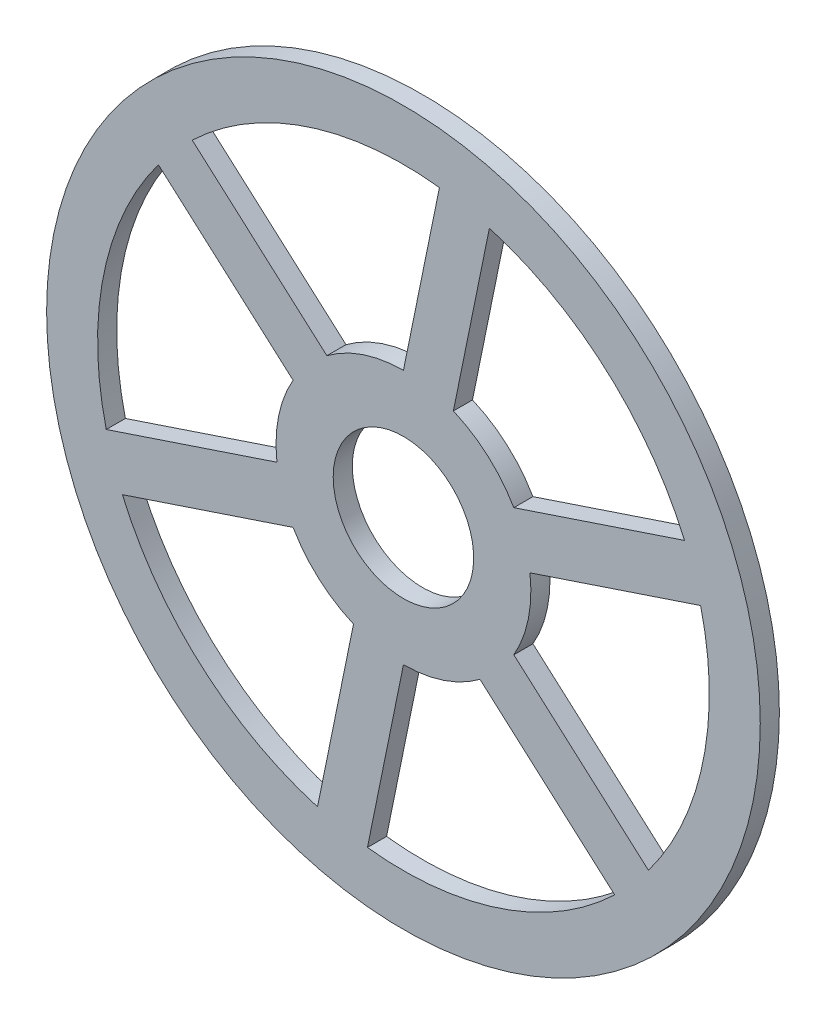
ISO-10303-21;
HEADER;
FILE_DESCRIPTION(('STEP AP214'),'2;1');
FILE_NAME('part.step','',(''),(''),'','','');
FILE_SCHEMA(('AUTOMOTIVE_DESIGN { 1 0 10303 214 1 1 1 1 }'));
ENDSEC;
DATA;
#1=APPLICATION_CONTEXT('core data for automotive mechanical design processes');
#2=APPLICATION_PROTOCOL_DEFINITION('international standard','automotive_design',2000,#1);
#3=PRODUCT_CONTEXT('',#1,'mechanical');
#4=PRODUCT('Part','Part','',(#3));
#5=PRODUCT_RELATED_PRODUCT_CATEGORY('part','',(#4));
#6=PRODUCT_DEFINITION_FORMATION('','',#4);
#7=PRODUCT_DEFINITION_CONTEXT('part definition',#1,'design');
#8=PRODUCT_DEFINITION('design','',#6,#7);
#9=PRODUCT_DEFINITION_SHAPE('','',#8);
#10=(LENGTH_UNIT() NAMED_UNIT(*) SI_UNIT(.MILLI.,.METRE.));
#11=(NAMED_UNIT(*) PLANE_ANGLE_UNIT() SI_UNIT($,.RADIAN.));
#12=(NAMED_UNIT(*) SI_UNIT($,.STERADIAN.) SOLID_ANGLE_UNIT());
#13=UNCERTAINTY_MEASURE_WITH_UNIT(LENGTH_MEASURE(1.E-05),#10,'distance_accuracy_value','');
#14=(GEOMETRIC_REPRESENTATION_CONTEXT(3) GLOBAL_UNCERTAINTY_ASSIGNED_CONTEXT((#13)) GLOBAL_UNIT_ASSIGNED_CONTEXT((#10,
#11,#12)) REPRESENTATION_CONTEXT('',''));
#15=CARTESIAN_POINT('',(0.,0.,0.));
#16=DIRECTION('',(0.,0.,1.));
#17=DIRECTION('',(1.,0.,0.));
#18=AXIS2_PLACEMENT_3D('',#15,#16,#17);
#19=CARTESIAN_POINT('',(0.,0.,4.7625));
#20=DIRECTION('',(0.,0.,1.));
#21=DIRECTION('',(1.,0.,0.));
#22=AXIS2_PLACEMENT_3D('',#19,#20,#21);
#23=PLANE('',#22);
#24=CARTESIAN_POINT('',(0.,0.,4.7625));
#25=DIRECTION('',(0.,0.,1.));
#26=DIRECTION('',(1.,0.,0.));
#27=AXIS2_PLACEMENT_3D('',#24,#25,#26);
#28=CIRCLE('',#27,88.9);
#29=CARTESIAN_POINT('',(-88.9,0.,4.7625));
#30=VERTEX_POINT('',#29);
#31=EDGE_CURVE('E11',#30,#30,#28,.T.);
#32=ORIENTED_EDGE('',*,*,#31,.T.);
#33=EDGE_LOOP('',(#32));
#34=FACE_BOUND('',#33,.T.);
#35=CARTESIAN_POINT('',(0.,0.,4.7625));
#36=DIRECTION('',(0.,0.,1.));
#37=DIRECTION('',(1.,0.,0.));
#38=AXIS2_PLACEMENT_3D('',#35,#36,#37);
#39=CIRCLE('',#38,17.5);
#40=CARTESIAN_POINT('',(-17.5,0.,4.7625));
#41=VERTEX_POINT('',#40);
#42=EDGE_CURVE('E385',#41,#41,#39,.T.);
#43=ORIENTED_EDGE('',*,*,#42,.F.);
#44=EDGE_LOOP('',(#43));
#45=FACE_BOUND('',#44,.T.);
#46=DIRECTION('',(0.200000000000003,0.979795897113271,0.));
#47=VECTOR('',#46,1.);
#48=CARTESIAN_POINT('',(8.96528719706963,75.6707580606542,4.7625));
#49=LINE('',#48,#47);
#50=CARTESIAN_POINT('',(0.,31.75,4.7625));
#51=VERTEX_POINT('',#50);
#52=CARTESIAN_POINT('',(8.96528719706962,75.6707580606542,4.7625));
#53=VERTEX_POINT('',#52);
#54=EDGE_CURVE('E356',#51,#53,#49,.T.);
#55=ORIENTED_EDGE('',*,*,#54,.F.);
#56=CARTESIAN_POINT('',(0.,0.,4.7625));
#57=DIRECTION('',(0.,0.,-1.));
#58=DIRECTION('',(-1.,0.,0.));
#59=AXIS2_PLACEMENT_3D('',#56,#57,#58);
#60=CIRCLE('',#59,31.75);
#61=CARTESIAN_POINT('',(-19.0748980978741,25.381307345283,4.7625));
#62=VERTEX_POINT('',#61);
#63=EDGE_CURVE('E354',#62,#51,#60,.T.);
#64=ORIENTED_EDGE('',*,*,#63,.F.);
#65=DIRECTION('',(0.748528137423855,-0.663103029313525,0.));
#66=VECTOR('',#65,1.);
#67=CARTESIAN_POINT('',(-52.628746733336,55.1058528404958,4.7625));
#68=LINE('',#67,#66);
#69=CARTESIAN_POINT('',(-52.628746733336,55.1058528404958,4.7625));
#70=VERTEX_POINT('',#69);
#71=EDGE_CURVE('E362',#70,#62,#68,.T.);
#72=ORIENTED_EDGE('',*,*,#71,.F.);
#73=CARTESIAN_POINT('',(0.,0.,4.7625));
#74=DIRECTION('',(0.,0.,1.));
#75=DIRECTION('',(-1.,0.,0.));
#76=AXIS2_PLACEMENT_3D('',#73,#74,#75);
#77=CIRCLE('',#76,76.2);
#78=EDGE_CURVE('E359',#53,#70,#77,.T.);
#79=ORIENTED_EDGE('',*,*,#78,.F.);
#80=EDGE_LOOP('',(#55,#64,#72,#79));
#81=FACE_BOUND('',#80,.T.);
#82=DIRECTION('',(0.948528137423858,0.316692867799745,0.));
#83=VECTOR('',#82,1.);
#84=CARTESIAN_POINT('',(70.0154424026874,30.0712125654414,4.7625));
#85=LINE('',#84,#83);
#86=CARTESIAN_POINT('',(27.4963065701559,15.875,4.7625));
#87=VERTEX_POINT('',#86);
#88=CARTESIAN_POINT('',(70.0154424026874,30.0712125654414,4.7625));
#89=VERTEX_POINT('',#88);
#90=EDGE_CURVE('E325',#87,#89,#85,.T.);
#91=ORIENTED_EDGE('',*,*,#90,.F.);
#92=CARTESIAN_POINT('',(0.,0.,4.7625));
#93=DIRECTION('',(0.,0.,-1.));
#94=DIRECTION('',(-1.,0.,0.));
#95=AXIS2_PLACEMENT_3D('',#92,#93,#94);
#96=CIRCLE('',#95,31.75);
#97=CARTESIAN_POINT('',(12.4434078933386,29.21,4.7625));
#98=VERTEX_POINT('',#97);
#99=EDGE_CURVE('E323',#98,#87,#96,.T.);
#100=ORIENTED_EDGE('',*,*,#99,.F.);
#101=DIRECTION('',(-0.200000000000002,-0.979795897113271,0.));
#102=VECTOR('',#101,1.);
#103=CARTESIAN_POINT('',(21.4086950904082,73.1307580606542,4.7625));
#104=LINE('',#103,#102);
#105=CARTESIAN_POINT('',(21.4086950904082,73.1307580606542,4.7625));
#106=VERTEX_POINT('',#105);
#107=EDGE_CURVE('E331',#106,#98,#104,.T.);
#108=ORIENTED_EDGE('',*,*,#107,.F.);
#109=CARTESIAN_POINT('',(0.,0.,4.7625));
#110=DIRECTION('',(0.,0.,1.));
#111=DIRECTION('',(-1.,0.,0.));
#112=AXIS2_PLACEMENT_3D('',#109,#110,#111);
#113=CIRCLE('',#112,76.2);
#114=EDGE_CURVE('E328',#89,#106,#113,.T.);
#115=ORIENTED_EDGE('',*,*,#114,.F.);
#116=EDGE_LOOP('',(#91,#100,#108,#115));
#117=FACE_BOUND('',#116,.T.);
#118=DIRECTION('',(0.748528137423855,-0.663103029313525,0.));
#119=VECTOR('',#118,1.);
#120=CARTESIAN_POINT('',(61.0501552056178,-45.5995454952128,4.7625));
#121=LINE('',#120,#119);
#122=CARTESIAN_POINT('',(27.4963065701559,-15.875,4.7625));
#123=VERTEX_POINT('',#122);
#124=CARTESIAN_POINT('',(61.0501552056178,-45.5995454952127,4.7625));
#125=VERTEX_POINT('',#124);
#126=EDGE_CURVE('E294',#123,#125,#121,.T.);
#127=ORIENTED_EDGE('',*,*,#126,.F.);
#128=CARTESIAN_POINT('',(0.,0.,4.7625));
#129=DIRECTION('',(0.,0.,-1.));
#130=DIRECTION('',(-1.,0.,0.));
#131=AXIS2_PLACEMENT_3D('',#128,#129,#130);
#132=CIRCLE('',#131,31.75);
#133=CARTESIAN_POINT('',(31.5183059912127,3.82869265471704,4.7625));
#134=VERTEX_POINT('',#133);
#135=EDGE_CURVE('E292',#134,#123,#132,.T.);
#136=ORIENTED_EDGE('',*,*,#135,.F.);
#137=DIRECTION('',(-0.948528137423858,-0.316692867799745,0.));
#138=VECTOR('',#137,1.);
#139=CARTESIAN_POINT('',(74.0374418237442,18.0249052201584,4.7625));
#140=LINE('',#139,#138);
#141=CARTESIAN_POINT('',(74.0374418237442,18.0249052201584,4.7625));
#142=VERTEX_POINT('',#141);
#143=EDGE_CURVE('E300',#142,#134,#140,.T.);
#144=ORIENTED_EDGE('',*,*,#143,.F.);
#145=CARTESIAN_POINT('',(0.,0.,4.7625));
#146=DIRECTION('',(0.,0.,1.));
#147=DIRECTION('',(-1.,0.,0.));
#148=AXIS2_PLACEMENT_3D('',#145,#146,#147);
#149=CIRCLE('',#148,76.2);
#150=EDGE_CURVE('E297',#125,#142,#149,.T.);
#151=ORIENTED_EDGE('',*,*,#150,.F.);
#152=EDGE_LOOP('',(#127,#136,#144,#151));
#153=FACE_BOUND('',#152,.T.);
#154=DIRECTION('',(-0.200000000000003,-0.979795897113271,0.));
#155=VECTOR('',#154,1.);
#156=CARTESIAN_POINT('',(-8.96528719706962,-75.6707580606542,4.7625));
#157=LINE('',#156,#155);
#158=CARTESIAN_POINT('',(0.,-31.75,4.7625));
#159=VERTEX_POINT('',#158);
#160=CARTESIAN_POINT('',(-8.96528719706959,-75.6707580606542,4.7625));
#161=VERTEX_POINT('',#160);
#162=EDGE_CURVE('E263',#159,#161,#157,.T.);
#163=ORIENTED_EDGE('',*,*,#162,.F.);
#164=CARTESIAN_POINT('',(0.,0.,4.7625));
#165=DIRECTION('',(0.,0.,-1.));
#166=DIRECTION('',(-1.,0.,0.));
#167=AXIS2_PLACEMENT_3D('',#164,#165,#166);
#168=CIRCLE('',#167,31.75);
#169=CARTESIAN_POINT('',(19.0748980978742,-25.381307345283,4.7625));
#170=VERTEX_POINT('',#169);
#171=EDGE_CURVE('E261',#170,#159,#168,.T.);
#172=ORIENTED_EDGE('',*,*,#171,.F.);
#173=DIRECTION('',(-0.748528137423855,0.663103029313526,0.));
#174=VECTOR('',#173,1.);
#175=CARTESIAN_POINT('',(52.628746733336,-55.1058528404957,4.7625));
#176=LINE('',#175,#174);
#177=CARTESIAN_POINT('',(52.628746733336,-55.1058528404957,4.7625));
#178=VERTEX_POINT('',#177);
#179=EDGE_CURVE('E269',#178,#170,#176,.T.);
#180=ORIENTED_EDGE('',*,*,#179,.F.);
#181=CARTESIAN_POINT('',(0.,0.,4.7625));
#182=DIRECTION('',(0.,0.,1.));
#183=DIRECTION('',(-1.,0.,0.));
#184=AXIS2_PLACEMENT_3D('',#181,#182,#183);
#185=CIRCLE('',#184,76.2);
#186=EDGE_CURVE('E266',#161,#178,#185,.T.);
#187=ORIENTED_EDGE('',*,*,#186,.F.);
#188=EDGE_LOOP('',(#163,#172,#180,#187));
#189=FACE_BOUND('',#188,.T.);
#190=DIRECTION('',(-0.948528137423858,-0.316692867799746,0.));
#191=VECTOR('',#190,1.);
#192=CARTESIAN_POINT('',(-70.0154424026874,-30.0712125654414,4.7625));
#193=LINE('',#192,#191);
#194=CARTESIAN_POINT('',(-27.4963065701559,-15.875,4.7625));
#195=VERTEX_POINT('',#194);
#196=CARTESIAN_POINT('',(-70.0154424026874,-30.0712125654415,4.7625));
#197=VERTEX_POINT('',#196);
#198=EDGE_CURVE('E232',#195,#197,#193,.T.);
#199=ORIENTED_EDGE('',*,*,#198,.F.);
#200=CARTESIAN_POINT('',(0.,0.,4.7625));
#201=DIRECTION('',(0.,0.,-1.));
#202=DIRECTION('',(-1.,0.,0.));
#203=AXIS2_PLACEMENT_3D('',#200,#201,#202);
#204=CIRCLE('',#203,31.75);
#205=CARTESIAN_POINT('',(-12.4434078933385,-29.21,4.7625));
#206=VERTEX_POINT('',#205);
#207=EDGE_CURVE('E230',#206,#195,#204,.T.);
#208=ORIENTED_EDGE('',*,*,#207,.F.);
#209=DIRECTION('',(0.200000000000003,0.979795897113271,0.));
#210=VECTOR('',#209,1.);
#211=CARTESIAN_POINT('',(-21.4086950904082,-73.1307580606542,4.7625));
#212=LINE('',#211,#210);
#213=CARTESIAN_POINT('',(-21.4086950904082,-73.1307580606542,4.7625));
#214=VERTEX_POINT('',#213);
#215=EDGE_CURVE('E238',#214,#206,#212,.T.);
#216=ORIENTED_EDGE('',*,*,#215,.F.);
#217=CARTESIAN_POINT('',(0.,0.,4.7625));
#218=DIRECTION('',(0.,0.,1.));
#219=DIRECTION('',(-1.,0.,0.));
#220=AXIS2_PLACEMENT_3D('',#217,#218,#219);
#221=CIRCLE('',#220,76.2);
#222=EDGE_CURVE('E235',#197,#214,#221,.T.);
#223=ORIENTED_EDGE('',*,*,#222,.F.);
#224=EDGE_LOOP('',(#199,#208,#216,#223));
#225=FACE_BOUND('',#224,.T.);
#226=DIRECTION('',(-0.748528137423856,0.663103029313525,0.));
#227=VECTOR('',#226,1.);
#228=CARTESIAN_POINT('',(-61.0501552056178,45.5995454952127,4.7625));
#229=LINE('',#228,#227);
#230=CARTESIAN_POINT('',(-27.496306570156,15.875,4.7625));
#231=VERTEX_POINT('',#230);
#232=CARTESIAN_POINT('',(-61.0501552056178,45.5995454952127,4.7625));
#233=VERTEX_POINT('',#232);
#234=EDGE_CURVE('E202',#231,#233,#229,.T.);
#235=ORIENTED_EDGE('',*,*,#234,.F.);
#236=CARTESIAN_POINT('',(0.,0.,4.7625));
#237=DIRECTION('',(0.,0.,-1.));
#238=DIRECTION('',(-1.,0.,0.));
#239=AXIS2_PLACEMENT_3D('',#236,#237,#238);
#240=CIRCLE('',#239,31.75);
#241=CARTESIAN_POINT('',(-31.5183059912127,-3.82869265471706,4.7625));
#242=VERTEX_POINT('',#241);
#243=EDGE_CURVE('E194',#242,#231,#240,.T.);
#244=ORIENTED_EDGE('',*,*,#243,.F.);
#245=DIRECTION('',(0.948528137423858,0.316692867799745,0.));
#246=VECTOR('',#245,1.);
#247=CARTESIAN_POINT('',(-74.0374418237442,-18.0249052201584,4.7625));
#248=LINE('',#247,#246);
#249=CARTESIAN_POINT('',(-74.0374418237442,-18.0249052201584,4.7625));
#250=VERTEX_POINT('',#249);
#251=EDGE_CURVE('E216',#250,#242,#248,.T.);
#252=ORIENTED_EDGE('',*,*,#251,.F.);
#253=CARTESIAN_POINT('',(0.,0.,4.7625));
#254=DIRECTION('',(0.,0.,1.));
#255=DIRECTION('',(-1.,0.,0.));
#256=AXIS2_PLACEMENT_3D('',#253,#254,#255);
#257=CIRCLE('',#256,76.2);
#258=EDGE_CURVE('E214',#233,#250,#257,.T.);
#259=ORIENTED_EDGE('',*,*,#258,.F.);
#260=EDGE_LOOP('',(#235,#244,#252,#259));
#261=FACE_BOUND('',#260,.T.);
#262=ADVANCED_FACE('F33',(#34,#45,#81,#117,#153,#189,#225,#261),#23,.T.);
#263=CARTESIAN_POINT('',(0.,0.,0.));
#264=DIRECTION('',(0.,0.,1.));
#265=DIRECTION('',(1.,0.,0.));
#266=AXIS2_PLACEMENT_3D('',#263,#264,#265);
#267=PLANE('',#266);
#268=CARTESIAN_POINT('',(0.,0.,0.));
#269=DIRECTION('',(0.,0.,-1.));
#270=DIRECTION('',(-1.,0.,0.));
#271=AXIS2_PLACEMENT_3D('',#268,#269,#270);
#272=CIRCLE('',#271,31.75);
#273=CARTESIAN_POINT('',(-12.4434078933385,-29.21,0.));
#274=VERTEX_POINT('',#273);
#275=CARTESIAN_POINT('',(-27.4963065701559,-15.875,0.));
#276=VERTEX_POINT('',#275);
#277=EDGE_CURVE('E210',#274,#276,#272,.T.);
#278=ORIENTED_EDGE('',*,*,#277,.T.);
#279=DIRECTION('',(-0.948528137423858,-0.316692867799746,0.));
#280=VECTOR('',#279,1.);
#281=CARTESIAN_POINT('',(-70.0154424026874,-30.0712125654414,0.));
#282=LINE('',#281,#280);
#283=CARTESIAN_POINT('',(-70.0154424026874,-30.0712125654415,0.));
#284=VERTEX_POINT('',#283);
#285=EDGE_CURVE('E243',#276,#284,#282,.T.);
#286=ORIENTED_EDGE('',*,*,#285,.T.);
#287=CARTESIAN_POINT('',(0.,0.,0.));
#288=DIRECTION('',(0.,0.,1.));
#289=DIRECTION('',(-1.,0.,0.));
#290=AXIS2_PLACEMENT_3D('',#287,#288,#289);
#291=CIRCLE('',#290,76.2);
#292=CARTESIAN_POINT('',(-21.4086950904082,-73.1307580606542,0.));
#293=VERTEX_POINT('',#292);
#294=EDGE_CURVE('E246',#284,#293,#291,.T.);
#295=ORIENTED_EDGE('',*,*,#294,.T.);
#296=DIRECTION('',(0.200000000000003,0.979795897113271,0.));
#297=VECTOR('',#296,1.);
#298=CARTESIAN_POINT('',(-21.4086950904082,-73.1307580606542,0.));
#299=LINE('',#298,#297);
#300=EDGE_CURVE('E233',#293,#274,#299,.T.);
#301=ORIENTED_EDGE('',*,*,#300,.T.);
#302=EDGE_LOOP('',(#278,#286,#295,#301));
#303=FACE_BOUND('',#302,.T.);
#304=CARTESIAN_POINT('',(0.,0.,0.));
#305=DIRECTION('',(0.,0.,-1.));
#306=DIRECTION('',(-1.,0.,0.));
#307=AXIS2_PLACEMENT_3D('',#304,#305,#306);
#308=CIRCLE('',#307,31.75);
#309=CARTESIAN_POINT('',(31.5183059912127,3.82869265471704,0.));
#310=VERTEX_POINT('',#309);
#311=CARTESIAN_POINT('',(27.4963065701559,-15.875,0.));
#312=VERTEX_POINT('',#311);
#313=EDGE_CURVE('E291',#310,#312,#308,.T.);
#314=ORIENTED_EDGE('',*,*,#313,.T.);
#315=DIRECTION('',(0.748528137423855,-0.663103029313525,0.));
#316=VECTOR('',#315,1.);
#317=CARTESIAN_POINT('',(61.0501552056178,-45.5995454952128,0.));
#318=LINE('',#317,#316);
#319=CARTESIAN_POINT('',(61.0501552056178,-45.5995454952127,0.));
#320=VERTEX_POINT('',#319);
#321=EDGE_CURVE('E305',#312,#320,#318,.T.);
#322=ORIENTED_EDGE('',*,*,#321,.T.);
#323=CARTESIAN_POINT('',(0.,0.,0.));
#324=DIRECTION('',(0.,0.,1.));
#325=DIRECTION('',(-1.,0.,0.));
#326=AXIS2_PLACEMENT_3D('',#323,#324,#325);
#327=CIRCLE('',#326,76.2);
#328=CARTESIAN_POINT('',(74.0374418237442,18.0249052201584,0.));
#329=VERTEX_POINT('',#328);
#330=EDGE_CURVE('E308',#320,#329,#327,.T.);
#331=ORIENTED_EDGE('',*,*,#330,.T.);
#332=DIRECTION('',(-0.948528137423858,-0.316692867799745,0.));
#333=VECTOR('',#332,1.);
#334=CARTESIAN_POINT('',(74.0374418237442,18.0249052201584,0.));
#335=LINE('',#334,#333);
#336=EDGE_CURVE('E295',#329,#310,#335,.T.);
#337=ORIENTED_EDGE('',*,*,#336,.T.);
#338=EDGE_LOOP('',(#314,#322,#331,#337));
#339=FACE_BOUND('',#338,.T.);
#340=CARTESIAN_POINT('',(0.,0.,0.));
#341=DIRECTION('',(0.,0.,-1.));
#342=DIRECTION('',(-1.,0.,0.));
#343=AXIS2_PLACEMENT_3D('',#340,#341,#342);
#344=CIRCLE('',#343,31.75);
#345=CARTESIAN_POINT('',(-19.0748980978741,25.381307345283,0.));
#346=VERTEX_POINT('',#345);
#347=CARTESIAN_POINT('',(0.,31.75,0.));
#348=VERTEX_POINT('',#347);
#349=EDGE_CURVE('E353',#346,#348,#344,.T.);
#350=ORIENTED_EDGE('',*,*,#349,.T.);
#351=DIRECTION('',(0.200000000000003,0.979795897113271,0.));
#352=VECTOR('',#351,1.);
#353=CARTESIAN_POINT('',(8.96528719706963,75.6707580606542,0.));
#354=LINE('',#353,#352);
#355=CARTESIAN_POINT('',(8.96528719706962,75.6707580606542,0.));
#356=VERTEX_POINT('',#355);
#357=EDGE_CURVE('E367',#348,#356,#354,.T.);
#358=ORIENTED_EDGE('',*,*,#357,.T.);
#359=CARTESIAN_POINT('',(0.,0.,0.));
#360=DIRECTION('',(0.,0.,1.));
#361=DIRECTION('',(-1.,0.,0.));
#362=AXIS2_PLACEMENT_3D('',#359,#360,#361);
#363=CIRCLE('',#362,76.2);
#364=CARTESIAN_POINT('',(-52.628746733336,55.1058528404958,0.));
#365=VERTEX_POINT('',#364);
#366=EDGE_CURVE('E370',#356,#365,#363,.T.);
#367=ORIENTED_EDGE('',*,*,#366,.T.);
#368=DIRECTION('',(0.748528137423855,-0.663103029313525,0.));
#369=VECTOR('',#368,1.);
#370=CARTESIAN_POINT('',(-52.628746733336,55.1058528404958,0.));
#371=LINE('',#370,#369);
#372=EDGE_CURVE('E357',#365,#346,#371,.T.);
#373=ORIENTED_EDGE('',*,*,#372,.T.);
#374=EDGE_LOOP('',(#350,#358,#367,#373));
#375=FACE_BOUND('',#374,.T.);
#376=CARTESIAN_POINT('',(0.,0.,0.));
#377=DIRECTION('',(0.,0.,1.));
#378=DIRECTION('',(1.,0.,0.));
#379=AXIS2_PLACEMENT_3D('',#376,#377,#378);
#380=CIRCLE('',#379,88.9);
#381=CARTESIAN_POINT('',(-88.9,0.,0.));
#382=VERTEX_POINT('',#381);
#383=EDGE_CURVE('E37',#382,#382,#380,.T.);
#384=ORIENTED_EDGE('',*,*,#383,.F.);
#385=EDGE_LOOP('',(#384));
#386=FACE_BOUND('',#385,.T.);
#387=CARTESIAN_POINT('',(0.,0.,0.));
#388=DIRECTION('',(0.,0.,1.));
#389=DIRECTION('',(1.,0.,0.));
#390=AXIS2_PLACEMENT_3D('',#387,#388,#389);
#391=CIRCLE('',#390,17.5);
#392=CARTESIAN_POINT('',(-17.5,0.,0.));
#393=VERTEX_POINT('',#392);
#394=EDGE_CURVE('E384',#393,#393,#391,.T.);
#395=ORIENTED_EDGE('',*,*,#394,.T.);
#396=EDGE_LOOP('',(#395));
#397=FACE_BOUND('',#396,.T.);
#398=CARTESIAN_POINT('',(0.,0.,0.));
#399=DIRECTION('',(0.,0.,-1.));
#400=DIRECTION('',(-1.,0.,0.));
#401=AXIS2_PLACEMENT_3D('',#398,#399,#400);
#402=CIRCLE('',#401,31.75);
#403=CARTESIAN_POINT('',(12.4434078933386,29.21,0.));
#404=VERTEX_POINT('',#403);
#405=CARTESIAN_POINT('',(27.4963065701559,15.875,0.));
#406=VERTEX_POINT('',#405);
#407=EDGE_CURVE('E322',#404,#406,#402,.T.);
#408=ORIENTED_EDGE('',*,*,#407,.T.);
#409=DIRECTION('',(0.948528137423858,0.316692867799745,0.));
#410=VECTOR('',#409,1.);
#411=CARTESIAN_POINT('',(70.0154424026874,30.0712125654414,0.));
#412=LINE('',#411,#410);
#413=CARTESIAN_POINT('',(70.0154424026874,30.0712125654414,0.));
#414=VERTEX_POINT('',#413);
#415=EDGE_CURVE('E336',#406,#414,#412,.T.);
#416=ORIENTED_EDGE('',*,*,#415,.T.);
#417=CARTESIAN_POINT('',(0.,0.,0.));
#418=DIRECTION('',(0.,0.,1.));
#419=DIRECTION('',(-1.,0.,0.));
#420=AXIS2_PLACEMENT_3D('',#417,#418,#419);
#421=CIRCLE('',#420,76.2);
#422=CARTESIAN_POINT('',(21.4086950904082,73.1307580606542,0.));
#423=VERTEX_POINT('',#422);
#424=EDGE_CURVE('E339',#414,#423,#421,.T.);
#425=ORIENTED_EDGE('',*,*,#424,.T.);
#426=DIRECTION('',(-0.200000000000002,-0.979795897113271,0.));
#427=VECTOR('',#426,1.);
#428=CARTESIAN_POINT('',(21.4086950904082,73.1307580606542,0.));
#429=LINE('',#428,#427);
#430=EDGE_CURVE('E326',#423,#404,#429,.T.);
#431=ORIENTED_EDGE('',*,*,#430,.T.);
#432=EDGE_LOOP('',(#408,#416,#425,#431));
#433=FACE_BOUND('',#432,.T.);
#434=CARTESIAN_POINT('',(0.,0.,0.));
#435=DIRECTION('',(0.,0.,-1.));
#436=DIRECTION('',(-1.,0.,0.));
#437=AXIS2_PLACEMENT_3D('',#434,#435,#436);
#438=CIRCLE('',#437,31.75);
#439=CARTESIAN_POINT('',(19.0748980978742,-25.381307345283,0.));
#440=VERTEX_POINT('',#439);
#441=CARTESIAN_POINT('',(0.,-31.75,0.));
#442=VERTEX_POINT('',#441);
#443=EDGE_CURVE('E260',#440,#442,#438,.T.);
#444=ORIENTED_EDGE('',*,*,#443,.T.);
#445=DIRECTION('',(-0.200000000000003,-0.979795897113271,0.));
#446=VECTOR('',#445,1.);
#447=CARTESIAN_POINT('',(-8.96528719706962,-75.6707580606542,0.));
#448=LINE('',#447,#446);
#449=CARTESIAN_POINT('',(-8.96528719706959,-75.6707580606542,0.));
#450=VERTEX_POINT('',#449);
#451=EDGE_CURVE('E274',#442,#450,#448,.T.);
#452=ORIENTED_EDGE('',*,*,#451,.T.);
#453=CARTESIAN_POINT('',(0.,0.,0.));
#454=DIRECTION('',(0.,0.,1.));
#455=DIRECTION('',(-1.,0.,0.));
#456=AXIS2_PLACEMENT_3D('',#453,#454,#455);
#457=CIRCLE('',#456,76.2);
#458=CARTESIAN_POINT('',(52.628746733336,-55.1058528404957,0.));
#459=VERTEX_POINT('',#458);
#460=EDGE_CURVE('E277',#450,#459,#457,.T.);
#461=ORIENTED_EDGE('',*,*,#460,.T.);
#462=DIRECTION('',(-0.748528137423855,0.663103029313526,0.));
#463=VECTOR('',#462,1.);
#464=CARTESIAN_POINT('',(52.628746733336,-55.1058528404957,0.));
#465=LINE('',#464,#463);
#466=EDGE_CURVE('E264',#459,#440,#465,.T.);
#467=ORIENTED_EDGE('',*,*,#466,.T.);
#468=EDGE_LOOP('',(#444,#452,#461,#467));
#469=FACE_BOUND('',#468,.T.);
#470=CARTESIAN_POINT('',(0.,0.,0.));
#471=DIRECTION('',(0.,0.,-1.));
#472=DIRECTION('',(-1.,0.,0.));
#473=AXIS2_PLACEMENT_3D('',#470,#471,#472);
#474=CIRCLE('',#473,31.75);
#475=CARTESIAN_POINT('',(-31.5183059912127,-3.82869265471706,0.));
#476=VERTEX_POINT('',#475);
#477=CARTESIAN_POINT('',(-27.496306570156,15.875,0.));
#478=VERTEX_POINT('',#477);
#479=EDGE_CURVE('E56',#476,#478,#474,.T.);
#480=ORIENTED_EDGE('',*,*,#479,.T.);
#481=DIRECTION('',(-0.748528137423856,0.663103029313525,0.));
#482=VECTOR('',#481,1.);
#483=CARTESIAN_POINT('',(-61.0501552056178,45.5995454952127,0.));
#484=LINE('',#483,#482);
#485=CARTESIAN_POINT('',(-61.0501552056178,45.5995454952127,0.));
#486=VERTEX_POINT('',#485);
#487=EDGE_CURVE('E209',#478,#486,#484,.T.);
#488=ORIENTED_EDGE('',*,*,#487,.T.);
#489=CARTESIAN_POINT('',(0.,0.,0.));
#490=DIRECTION('',(0.,0.,1.));
#491=DIRECTION('',(-1.,0.,0.));
#492=AXIS2_PLACEMENT_3D('',#489,#490,#491);
#493=CIRCLE('',#492,76.2);
#494=CARTESIAN_POINT('',(-74.0374418237442,-18.0249052201584,0.));
#495=VERTEX_POINT('',#494);
#496=EDGE_CURVE('E222',#486,#495,#493,.T.);
#497=ORIENTED_EDGE('',*,*,#496,.T.);
#498=DIRECTION('',(0.948528137423858,0.316692867799745,0.));
#499=VECTOR('',#498,1.);
#500=CARTESIAN_POINT('',(-74.0374418237442,-18.0249052201584,0.));
#501=LINE('',#500,#499);
#502=EDGE_CURVE('E203',#495,#476,#501,.T.);
#503=ORIENTED_EDGE('',*,*,#502,.T.);
#504=EDGE_LOOP('',(#480,#488,#497,#503));
#505=FACE_BOUND('',#504,.T.);
#506=ADVANCED_FACE('F391',(#303,#339,#375,#386,#397,#433,#469,#505),#267,.F.);
#507=CARTESIAN_POINT('',(0.,0.,4.7625));
#508=DIRECTION('',(0.,0.,-1.));
#509=DIRECTION('',(-1.,0.,0.));
#510=AXIS2_PLACEMENT_3D('',#507,#508,#509);
#511=CYLINDRICAL_SURFACE('',#510,88.9);
#512=CARTESIAN_POINT('',(-88.9,0.,4.7625));
#513=CARTESIAN_POINT('',(-88.9,0.,4.712890625));
#514=CARTESIAN_POINT('',(-88.9,0.,4.66328125));
#515=CARTESIAN_POINT('',(-88.9,0.,4.5640625));
#516=CARTESIAN_POINT('',(-88.9,0.,4.514453125));
#517=CARTESIAN_POINT('',(-88.9,0.,4.415234375));
#518=CARTESIAN_POINT('',(-88.9,0.,4.365625));
#519=CARTESIAN_POINT('',(-88.9,0.,4.26640625));
#520=CARTESIAN_POINT('',(-88.9,0.,4.216796875));
#521=CARTESIAN_POINT('',(-88.9,0.,4.117578125));
#522=CARTESIAN_POINT('',(-88.9,0.,4.06796875));
#523=CARTESIAN_POINT('',(-88.9,0.,3.96875));
#524=CARTESIAN_POINT('',(-88.9,0.,3.919140625));
#525=CARTESIAN_POINT('',(-88.9,0.,3.819921875));
#526=CARTESIAN_POINT('',(-88.9,0.,3.7703125));
#527=CARTESIAN_POINT('',(-88.9,0.,3.67109375));
#528=CARTESIAN_POINT('',(-88.9,0.,3.621484375));
#529=CARTESIAN_POINT('',(-88.9,0.,3.522265625));
#530=CARTESIAN_POINT('',(-88.9,0.,3.47265625));
#531=CARTESIAN_POINT('',(-88.9,0.,3.3734375));
#532=CARTESIAN_POINT('',(-88.9,0.,3.323828125));
#533=CARTESIAN_POINT('',(-88.9,0.,3.224609375));
#534=CARTESIAN_POINT('',(-88.9,0.,3.175));
#535=CARTESIAN_POINT('',(-88.9,0.,3.07578125));
#536=CARTESIAN_POINT('',(-88.9,0.,3.026171875));
#537=CARTESIAN_POINT('',(-88.9,0.,2.926953125));
#538=CARTESIAN_POINT('',(-88.9,0.,2.87734375));
#539=CARTESIAN_POINT('',(-88.9,0.,2.778125));
#540=CARTESIAN_POINT('',(-88.9,0.,2.728515625));
#541=CARTESIAN_POINT('',(-88.9,0.,2.629296875));
#542=CARTESIAN_POINT('',(-88.9,0.,2.5796875));
#543=CARTESIAN_POINT('',(-88.9,0.,2.48046875));
#544=CARTESIAN_POINT('',(-88.9,0.,2.430859375));
#545=CARTESIAN_POINT('',(-88.9,0.,2.331640625));
#546=CARTESIAN_POINT('',(-88.9,0.,2.28203125));
#547=CARTESIAN_POINT('',(-88.9,0.,2.1828125));
#548=CARTESIAN_POINT('',(-88.9,0.,2.133203125));
#549=CARTESIAN_POINT('',(-88.9,0.,2.033984375));
#550=CARTESIAN_POINT('',(-88.9,0.,1.984375));
#551=CARTESIAN_POINT('',(-88.9,0.,1.88515625));
#552=CARTESIAN_POINT('',(-88.9,0.,1.835546875));
#553=CARTESIAN_POINT('',(-88.9,0.,1.736328125));
#554=CARTESIAN_POINT('',(-88.9,0.,1.68671875));
#555=CARTESIAN_POINT('',(-88.9,0.,1.5875));
#556=CARTESIAN_POINT('',(-88.9,0.,1.537890625));
#557=CARTESIAN_POINT('',(-88.9,0.,1.438671875));
#558=CARTESIAN_POINT('',(-88.9,0.,1.3890625));
#559=CARTESIAN_POINT('',(-88.9,0.,1.28984375));
#560=CARTESIAN_POINT('',(-88.9,0.,1.240234375));
#561=CARTESIAN_POINT('',(-88.9,0.,1.141015625));
#562=CARTESIAN_POINT('',(-88.9,0.,1.09140625));
#563=CARTESIAN_POINT('',(-88.9,0.,0.9921875));
#564=CARTESIAN_POINT('',(-88.9,0.,0.942578125));
#565=CARTESIAN_POINT('',(-88.9,0.,0.843359375));
#566=CARTESIAN_POINT('',(-88.9,0.,0.79375));
#567=CARTESIAN_POINT('',(-88.9,0.,0.69453125));
#568=CARTESIAN_POINT('',(-88.9,0.,0.644921875));
#569=CARTESIAN_POINT('',(-88.9,0.,0.545703125));
#570=CARTESIAN_POINT('',(-88.9,0.,0.49609375));
#571=CARTESIAN_POINT('',(-88.9,0.,0.396875));
#572=CARTESIAN_POINT('',(-88.9,0.,0.347265625));
#573=CARTESIAN_POINT('',(-88.9,0.,0.248046875));
#574=CARTESIAN_POINT('',(-88.9,0.,0.1984375));
#575=CARTESIAN_POINT('',(-88.9,0.,0.09921875));
#576=CARTESIAN_POINT('',(-88.9,0.,0.049609375));
#577=CARTESIAN_POINT('',(-88.9,0.,0.));
#578=B_SPLINE_CURVE_WITH_KNOTS('',3,(#512,#513,#514,#515,#516,#517,#518,#519,#520,#521,#522,
#523,#524,#525,#526,#527,#528,#529,#530,#531,#532,#533,#534,#535,#536,#537,#538,#539,#540,#541,
#542,#543,#544,#545,#546,#547,#548,#549,#550,#551,#552,#553,#554,#555,#556,#557,#558,#559,#560,
#561,#562,#563,#564,#565,#566,#567,#568,#569,#570,#571,#572,#573,#574,#575,#576,#577),
.UNSPECIFIED.,.F.,.F.,(4,2,2,2,2,2,2,2,2,2,2,2,2,2,2,2,2,2,2,2,2,2,2,2,2,2,2,2,2,2,2,2,4),(0.,
0.148828124999999,0.297656249999999,0.446484374999999,0.595312499999999,0.744140625,0.89296875,
1.041796875,1.190625,1.339453125,1.48828125,1.637109375,1.7859375,1.934765625,2.08359375,
2.232421875,2.38125,2.530078125,2.67890625,2.827734375,2.9765625,3.125390625,3.27421875,
3.423046875,3.571875,3.720703125,3.86953125,4.018359375,4.1671875,4.316015625,4.46484375,
4.613671875,4.7625),.UNSPECIFIED.);
#579=EDGE_CURVE('BSEAM35',#30,#382,#578,.T.);
#580=ORIENTED_EDGE('',*,*,#31,.F.);
#581=ORIENTED_EDGE('',*,*,#383,.T.);
#582=ORIENTED_EDGE('',*,*,#579,.T.);
#583=ORIENTED_EDGE('',*,*,#579,.F.);
#584=EDGE_LOOP('',(#580,#582,#581,#583));
#585=FACE_BOUND('',#584,.T.);
#586=ADVANCED_FACE('F35',(#585),#511,.T.);
#587=CARTESIAN_POINT('',(0.,0.,4.7625));
#588=DIRECTION('',(0.,0.,-1.));
#589=DIRECTION('',(-1.,0.,0.));
#590=AXIS2_PLACEMENT_3D('',#587,#588,#589);
#591=CYLINDRICAL_SURFACE('',#590,17.5);
#592=CARTESIAN_POINT('',(-17.5,0.,4.7625));
#593=CARTESIAN_POINT('',(-17.5,0.,4.712890625));
#594=CARTESIAN_POINT('',(-17.5,0.,4.66328125));
#595=CARTESIAN_POINT('',(-17.5,0.,4.5640625));
#596=CARTESIAN_POINT('',(-17.5,0.,4.514453125));
#597=CARTESIAN_POINT('',(-17.5,0.,4.415234375));
#598=CARTESIAN_POINT('',(-17.5,0.,4.365625));
#599=CARTESIAN_POINT('',(-17.5,0.,4.26640625));
#600=CARTESIAN_POINT('',(-17.5,0.,4.216796875));
#601=CARTESIAN_POINT('',(-17.5,0.,4.117578125));
#602=CARTESIAN_POINT('',(-17.5,0.,4.06796875));
#603=CARTESIAN_POINT('',(-17.5,0.,3.96875));
#604=CARTESIAN_POINT('',(-17.5,0.,3.919140625));
#605=CARTESIAN_POINT('',(-17.5,0.,3.819921875));
#606=CARTESIAN_POINT('',(-17.5,0.,3.7703125));
#607=CARTESIAN_POINT('',(-17.5,0.,3.67109375));
#608=CARTESIAN_POINT('',(-17.5,0.,3.621484375));
#609=CARTESIAN_POINT('',(-17.5,0.,3.522265625));
#610=CARTESIAN_POINT('',(-17.5,0.,3.47265625));
#611=CARTESIAN_POINT('',(-17.5,0.,3.3734375));
#612=CARTESIAN_POINT('',(-17.5,0.,3.323828125));
#613=CARTESIAN_POINT('',(-17.5,0.,3.224609375));
#614=CARTESIAN_POINT('',(-17.5,0.,3.175));
#615=CARTESIAN_POINT('',(-17.5,0.,3.07578125));
#616=CARTESIAN_POINT('',(-17.5,0.,3.026171875));
#617=CARTESIAN_POINT('',(-17.5,0.,2.926953125));
#618=CARTESIAN_POINT('',(-17.5,0.,2.87734375));
#619=CARTESIAN_POINT('',(-17.5,0.,2.778125));
#620=CARTESIAN_POINT('',(-17.5,0.,2.728515625));
#621=CARTESIAN_POINT('',(-17.5,0.,2.629296875));
#622=CARTESIAN_POINT('',(-17.5,0.,2.5796875));
#623=CARTESIAN_POINT('',(-17.5,0.,2.48046875));
#624=CARTESIAN_POINT('',(-17.5,0.,2.430859375));
#625=CARTESIAN_POINT('',(-17.5,0.,2.331640625));
#626=CARTESIAN_POINT('',(-17.5,0.,2.28203125));
#627=CARTESIAN_POINT('',(-17.5,0.,2.1828125));
#628=CARTESIAN_POINT('',(-17.5,0.,2.133203125));
#629=CARTESIAN_POINT('',(-17.5,0.,2.033984375));
#630=CARTESIAN_POINT('',(-17.5,0.,1.984375));
#631=CARTESIAN_POINT('',(-17.5,0.,1.88515625));
#632=CARTESIAN_POINT('',(-17.5,0.,1.835546875));
#633=CARTESIAN_POINT('',(-17.5,0.,1.736328125));
#634=CARTESIAN_POINT('',(-17.5,0.,1.68671875));
#635=CARTESIAN_POINT('',(-17.5,0.,1.5875));
#636=CARTESIAN_POINT('',(-17.5,0.,1.537890625));
#637=CARTESIAN_POINT('',(-17.5,0.,1.438671875));
#638=CARTESIAN_POINT('',(-17.5,0.,1.3890625));
#639=CARTESIAN_POINT('',(-17.5,0.,1.28984375));
#640=CARTESIAN_POINT('',(-17.5,0.,1.240234375));
#641=CARTESIAN_POINT('',(-17.5,0.,1.141015625));
#642=CARTESIAN_POINT('',(-17.5,0.,1.09140625));
#643=CARTESIAN_POINT('',(-17.5,0.,0.9921875));
#644=CARTESIAN_POINT('',(-17.5,0.,0.942578125));
#645=CARTESIAN_POINT('',(-17.5,0.,0.843359375));
#646=CARTESIAN_POINT('',(-17.5,0.,0.79375));
#647=CARTESIAN_POINT('',(-17.5,0.,0.69453125));
#648=CARTESIAN_POINT('',(-17.5,0.,0.644921875));
#649=CARTESIAN_POINT('',(-17.5,0.,0.545703125));
#650=CARTESIAN_POINT('',(-17.5,0.,0.49609375));
#651=CARTESIAN_POINT('',(-17.5,0.,0.396875));
#652=CARTESIAN_POINT('',(-17.5,0.,0.347265625));
#653=CARTESIAN_POINT('',(-17.5,0.,0.248046875));
#654=CARTESIAN_POINT('',(-17.5,0.,0.1984375));
#655=CARTESIAN_POINT('',(-17.5,0.,0.09921875));
#656=CARTESIAN_POINT('',(-17.5,0.,0.049609375));
#657=CARTESIAN_POINT('',(-17.5,0.,0.));
#658=B_SPLINE_CURVE_WITH_KNOTS('',3,(#592,#593,#594,#595,#596,#597,#598,#599,#600,#601,#602,
#603,#604,#605,#606,#607,#608,#609,#610,#611,#612,#613,#614,#615,#616,#617,#618,#619,#620,#621,
#622,#623,#624,#625,#626,#627,#628,#629,#630,#631,#632,#633,#634,#635,#636,#637,#638,#639,#640,
#641,#642,#643,#644,#645,#646,#647,#648,#649,#650,#651,#652,#653,#654,#655,#656,#657),
.UNSPECIFIED.,.F.,.F.,(4,2,2,2,2,2,2,2,2,2,2,2,2,2,2,2,2,2,2,2,2,2,2,2,2,2,2,2,2,2,2,2,4),(0.,
0.148828124999999,0.297656249999999,0.446484374999999,0.595312499999999,0.744140625,0.89296875,
1.041796875,1.190625,1.339453125,1.48828125,1.637109375,1.7859375,1.934765625,2.08359375,
2.232421875,2.38125,2.530078125,2.67890625,2.827734375,2.9765625,3.125390625,3.27421875,
3.423046875,3.571875,3.720703125,3.86953125,4.018359375,4.1671875,4.316015625,4.46484375,
4.613671875,4.7625),.UNSPECIFIED.);
#659=EDGE_CURVE('BSEAM394',#41,#393,#658,.T.);
#660=ORIENTED_EDGE('',*,*,#42,.T.);
#661=ORIENTED_EDGE('',*,*,#394,.F.);
#662=ORIENTED_EDGE('',*,*,#659,.T.);
#663=ORIENTED_EDGE('',*,*,#659,.F.);
#664=EDGE_LOOP('',(#660,#662,#661,#663));
#665=FACE_BOUND('',#664,.T.);
#666=ADVANCED_FACE('F394',(#665),#591,.F.);
#667=CARTESIAN_POINT('',(0.,0.,4.7625));
#668=DIRECTION('',(0.,0.,-1.));
#669=DIRECTION('',(-1.,0.,0.));
#670=AXIS2_PLACEMENT_3D('',#667,#668,#669);
#671=CYLINDRICAL_SURFACE('',#670,31.75);
#672=ORIENTED_EDGE('',*,*,#349,.F.);
#673=DIRECTION('',(0.,0.,-1.));
#674=VECTOR('',#673,1.);
#675=CARTESIAN_POINT('',(-19.0748980978741,25.381307345283,4.7625));
#676=LINE('',#675,#674);
#677=EDGE_CURVE('E364',#62,#346,#676,.T.);
#678=ORIENTED_EDGE('',*,*,#677,.F.);
#679=ORIENTED_EDGE('',*,*,#63,.T.);
#680=DIRECTION('',(0.,0.,-1.));
#681=VECTOR('',#680,1.);
#682=CARTESIAN_POINT('',(0.,31.75,4.7625));
#683=LINE('',#682,#681);
#684=EDGE_CURVE('E381',#51,#348,#683,.T.);
#685=ORIENTED_EDGE('',*,*,#684,.T.);
#686=EDGE_LOOP('',(#672,#678,#679,#685));
#687=FACE_BOUND('',#686,.T.);
#688=ADVANCED_FACE('F396',(#687),#671,.T.);
#689=CARTESIAN_POINT('',(8.96528719706963,75.6707580606542,4.7625));
#690=DIRECTION('',(-0.979795897113271,0.200000000000003,0.));
#691=DIRECTION('',(-0.200000000000003,-0.979795897113271,0.));
#692=AXIS2_PLACEMENT_3D('',#689,#690,#691);
#693=PLANE('',#692);
#694=ORIENTED_EDGE('',*,*,#357,.F.);
#695=ORIENTED_EDGE('',*,*,#684,.F.);
#696=ORIENTED_EDGE('',*,*,#54,.T.);
#697=DIRECTION('',(0.,0.,-1.));
#698=VECTOR('',#697,1.);
#699=CARTESIAN_POINT('',(8.96528719706962,75.6707580606542,4.7625));
#700=LINE('',#699,#698);
#701=EDGE_CURVE('E379',#53,#356,#700,.T.);
#702=ORIENTED_EDGE('',*,*,#701,.T.);
#703=EDGE_LOOP('',(#694,#695,#696,#702));
#704=FACE_BOUND('',#703,.T.);
#705=ADVANCED_FACE('F403',(#704),#693,.T.);
#706=CARTESIAN_POINT('',(0.,0.,4.7625));
#707=DIRECTION('',(0.,0.,-1.));
#708=DIRECTION('',(-1.,0.,0.));
#709=AXIS2_PLACEMENT_3D('',#706,#707,#708);
#710=CYLINDRICAL_SURFACE('',#709,76.2);
#711=ORIENTED_EDGE('',*,*,#366,.F.);
#712=ORIENTED_EDGE('',*,*,#701,.F.);
#713=ORIENTED_EDGE('',*,*,#78,.T.);
#714=DIRECTION('',(0.,0.,-1.));
#715=VECTOR('',#714,1.);
#716=CARTESIAN_POINT('',(-52.628746733336,55.1058528404958,4.7625));
#717=LINE('',#716,#715);
#718=EDGE_CURVE('E377',#70,#365,#717,.T.);
#719=ORIENTED_EDGE('',*,*,#718,.T.);
#720=EDGE_LOOP('',(#711,#712,#713,#719));
#721=FACE_BOUND('',#720,.T.);
#722=ADVANCED_FACE('F517',(#721),#710,.F.);
#723=CARTESIAN_POINT('',(-52.628746733336,55.1058528404958,4.7625));
#724=DIRECTION('',(0.663103029313525,0.748528137423856,0.));
#725=DIRECTION('',(-0.748528137423856,0.663103029313525,0.));
#726=AXIS2_PLACEMENT_3D('',#723,#724,#725);
#727=PLANE('',#726);
#728=ORIENTED_EDGE('',*,*,#372,.F.);
#729=ORIENTED_EDGE('',*,*,#718,.F.);
#730=ORIENTED_EDGE('',*,*,#71,.T.);
#731=ORIENTED_EDGE('',*,*,#677,.T.);
#732=EDGE_LOOP('',(#728,#729,#730,#731));
#733=FACE_BOUND('',#732,.T.);
#734=ADVANCED_FACE('F513',(#733),#727,.T.);
#735=CARTESIAN_POINT('',(0.,0.,4.7625));
#736=DIRECTION('',(0.,0.,-1.));
#737=DIRECTION('',(-1.,0.,0.));
#738=AXIS2_PLACEMENT_3D('',#735,#736,#737);
#739=CYLINDRICAL_SURFACE('',#738,31.75);
#740=ORIENTED_EDGE('',*,*,#407,.F.);
#741=DIRECTION('',(0.,0.,-1.));
#742=VECTOR('',#741,1.);
#743=CARTESIAN_POINT('',(12.4434078933386,29.21,4.7625));
#744=LINE('',#743,#742);
#745=EDGE_CURVE('E333',#98,#404,#744,.T.);
#746=ORIENTED_EDGE('',*,*,#745,.F.);
#747=ORIENTED_EDGE('',*,*,#99,.T.);
#748=DIRECTION('',(0.,0.,-1.));
#749=VECTOR('',#748,1.);
#750=CARTESIAN_POINT('',(27.4963065701559,15.875,4.7625));
#751=LINE('',#750,#749);
#752=EDGE_CURVE('E350',#87,#406,#751,.T.);
#753=ORIENTED_EDGE('',*,*,#752,.T.);
#754=EDGE_LOOP('',(#740,#746,#747,#753));
#755=FACE_BOUND('',#754,.T.);
#756=ADVANCED_FACE('F509',(#755),#739,.T.);
#757=CARTESIAN_POINT('',(70.0154424026874,30.0712125654414,4.7625));
#758=DIRECTION('',(-0.316692867799745,0.948528137423858,0.));
#759=DIRECTION('',(-0.948528137423858,-0.316692867799745,0.));
#760=AXIS2_PLACEMENT_3D('',#757,#758,#759);
#761=PLANE('',#760);
#762=ORIENTED_EDGE('',*,*,#415,.F.);
#763=ORIENTED_EDGE('',*,*,#752,.F.);
#764=ORIENTED_EDGE('',*,*,#90,.T.);
#765=DIRECTION('',(0.,0.,-1.));
#766=VECTOR('',#765,1.);
#767=CARTESIAN_POINT('',(70.0154424026874,30.0712125654414,4.7625));
#768=LINE('',#767,#766);
#769=EDGE_CURVE('E348',#89,#414,#768,.T.);
#770=ORIENTED_EDGE('',*,*,#769,.T.);
#771=EDGE_LOOP('',(#762,#763,#764,#770));
#772=FACE_BOUND('',#771,.T.);
#773=ADVANCED_FACE('F505',(#772),#761,.T.);
#774=CARTESIAN_POINT('',(0.,0.,4.7625));
#775=DIRECTION('',(0.,0.,-1.));
#776=DIRECTION('',(-1.,0.,0.));
#777=AXIS2_PLACEMENT_3D('',#774,#775,#776);
#778=CYLINDRICAL_SURFACE('',#777,76.2);
#779=ORIENTED_EDGE('',*,*,#424,.F.);
#780=ORIENTED_EDGE('',*,*,#769,.F.);
#781=ORIENTED_EDGE('',*,*,#114,.T.);
#782=DIRECTION('',(0.,0.,-1.));
#783=VECTOR('',#782,1.);
#784=CARTESIAN_POINT('',(21.4086950904082,73.1307580606542,4.7625));
#785=LINE('',#784,#783);
#786=EDGE_CURVE('E346',#106,#423,#785,.T.);
#787=ORIENTED_EDGE('',*,*,#786,.T.);
#788=EDGE_LOOP('',(#779,#780,#781,#787));
#789=FACE_BOUND('',#788,.T.);
#790=ADVANCED_FACE('F501',(#789),#778,.F.);
#791=CARTESIAN_POINT('',(21.4086950904082,73.1307580606542,4.7625));
#792=DIRECTION('',(0.979795897113271,-0.200000000000002,0.));
#793=DIRECTION('',(0.200000000000002,0.979795897113271,0.));
#794=AXIS2_PLACEMENT_3D('',#791,#792,#793);
#795=PLANE('',#794);
#796=ORIENTED_EDGE('',*,*,#430,.F.);
#797=ORIENTED_EDGE('',*,*,#786,.F.);
#798=ORIENTED_EDGE('',*,*,#107,.T.);
#799=ORIENTED_EDGE('',*,*,#745,.T.);
#800=EDGE_LOOP('',(#796,#797,#798,#799));
#801=FACE_BOUND('',#800,.T.);
#802=ADVANCED_FACE('F497',(#801),#795,.T.);
#803=CARTESIAN_POINT('',(0.,0.,4.7625));
#804=DIRECTION('',(0.,0.,-1.));
#805=DIRECTION('',(-1.,0.,0.));
#806=AXIS2_PLACEMENT_3D('',#803,#804,#805);
#807=CYLINDRICAL_SURFACE('',#806,31.75);
#808=ORIENTED_EDGE('',*,*,#313,.F.);
#809=DIRECTION('',(0.,0.,-1.));
#810=VECTOR('',#809,1.);
#811=CARTESIAN_POINT('',(31.5183059912127,3.82869265471704,4.7625));
#812=LINE('',#811,#810);
#813=EDGE_CURVE('E302',#134,#310,#812,.T.);
#814=ORIENTED_EDGE('',*,*,#813,.F.);
#815=ORIENTED_EDGE('',*,*,#135,.T.);
#816=DIRECTION('',(0.,0.,-1.));
#817=VECTOR('',#816,1.);
#818=CARTESIAN_POINT('',(27.4963065701559,-15.875,4.7625));
#819=LINE('',#818,#817);
#820=EDGE_CURVE('E319',#123,#312,#819,.T.);
#821=ORIENTED_EDGE('',*,*,#820,.T.);
#822=EDGE_LOOP('',(#808,#814,#815,#821));
#823=FACE_BOUND('',#822,.T.);
#824=ADVANCED_FACE('F493',(#823),#807,.T.);
#825=CARTESIAN_POINT('',(61.0501552056178,-45.5995454952128,4.7625));
#826=DIRECTION('',(0.663103029313525,0.748528137423855,0.));
#827=DIRECTION('',(-0.748528137423855,0.663103029313525,0.));
#828=AXIS2_PLACEMENT_3D('',#825,#826,#827);
#829=PLANE('',#828);
#830=ORIENTED_EDGE('',*,*,#321,.F.);
#831=ORIENTED_EDGE('',*,*,#820,.F.);
#832=ORIENTED_EDGE('',*,*,#126,.T.);
#833=DIRECTION('',(0.,0.,-1.));
#834=VECTOR('',#833,1.);
#835=CARTESIAN_POINT('',(61.0501552056178,-45.5995454952127,4.7625));
#836=LINE('',#835,#834);
#837=EDGE_CURVE('E317',#125,#320,#836,.T.);
#838=ORIENTED_EDGE('',*,*,#837,.T.);
#839=EDGE_LOOP('',(#830,#831,#832,#838));
#840=FACE_BOUND('',#839,.T.);
#841=ADVANCED_FACE('F489',(#840),#829,.T.);
#842=CARTESIAN_POINT('',(0.,0.,4.7625));
#843=DIRECTION('',(0.,0.,-1.));
#844=DIRECTION('',(-1.,0.,0.));
#845=AXIS2_PLACEMENT_3D('',#842,#843,#844);
#846=CYLINDRICAL_SURFACE('',#845,76.2);
#847=ORIENTED_EDGE('',*,*,#330,.F.);
#848=ORIENTED_EDGE('',*,*,#837,.F.);
#849=ORIENTED_EDGE('',*,*,#150,.T.);
#850=DIRECTION('',(0.,0.,-1.));
#851=VECTOR('',#850,1.);
#852=CARTESIAN_POINT('',(74.0374418237442,18.0249052201584,4.7625));
#853=LINE('',#852,#851);
#854=EDGE_CURVE('E315',#142,#329,#853,.T.);
#855=ORIENTED_EDGE('',*,*,#854,.T.);
#856=EDGE_LOOP('',(#847,#848,#849,#855));
#857=FACE_BOUND('',#856,.T.);
#858=ADVANCED_FACE('F485',(#857),#846,.F.);
#859=CARTESIAN_POINT('',(74.0374418237442,18.0249052201584,4.7625));
#860=DIRECTION('',(0.316692867799745,-0.948528137423858,0.));
#861=DIRECTION('',(0.948528137423858,0.316692867799745,0.));
#862=AXIS2_PLACEMENT_3D('',#859,#860,#861);
#863=PLANE('',#862);
#864=ORIENTED_EDGE('',*,*,#336,.F.);
#865=ORIENTED_EDGE('',*,*,#854,.F.);
#866=ORIENTED_EDGE('',*,*,#143,.T.);
#867=ORIENTED_EDGE('',*,*,#813,.T.);
#868=EDGE_LOOP('',(#864,#865,#866,#867));
#869=FACE_BOUND('',#868,.T.);
#870=ADVANCED_FACE('F481',(#869),#863,.T.);
#871=CARTESIAN_POINT('',(0.,0.,4.7625));
#872=DIRECTION('',(0.,0.,-1.));
#873=DIRECTION('',(-1.,0.,0.));
#874=AXIS2_PLACEMENT_3D('',#871,#872,#873);
#875=CYLINDRICAL_SURFACE('',#874,31.75);
#876=ORIENTED_EDGE('',*,*,#443,.F.);
#877=DIRECTION('',(0.,0.,-1.));
#878=VECTOR('',#877,1.);
#879=CARTESIAN_POINT('',(19.0748980978742,-25.381307345283,4.7625));
#880=LINE('',#879,#878);
#881=EDGE_CURVE('E271',#170,#440,#880,.T.);
#882=ORIENTED_EDGE('',*,*,#881,.F.);
#883=ORIENTED_EDGE('',*,*,#171,.T.);
#884=DIRECTION('',(0.,0.,-1.));
#885=VECTOR('',#884,1.);
#886=CARTESIAN_POINT('',(0.,-31.75,4.7625));
#887=LINE('',#886,#885);
#888=EDGE_CURVE('E288',#159,#442,#887,.T.);
#889=ORIENTED_EDGE('',*,*,#888,.T.);
#890=EDGE_LOOP('',(#876,#882,#883,#889));
#891=FACE_BOUND('',#890,.T.);
#892=ADVANCED_FACE('F477',(#891),#875,.T.);
#893=CARTESIAN_POINT('',(-8.96528719706962,-75.6707580606542,4.7625));
#894=DIRECTION('',(0.979795897113271,-0.200000000000003,0.));
#895=DIRECTION('',(0.200000000000003,0.979795897113271,0.));
#896=AXIS2_PLACEMENT_3D('',#893,#894,#895);
#897=PLANE('',#896);
#898=ORIENTED_EDGE('',*,*,#451,.F.);
#899=ORIENTED_EDGE('',*,*,#888,.F.);
#900=ORIENTED_EDGE('',*,*,#162,.T.);
#901=DIRECTION('',(0.,0.,-1.));
#902=VECTOR('',#901,1.);
#903=CARTESIAN_POINT('',(-8.96528719706959,-75.6707580606542,4.7625));
#904=LINE('',#903,#902);
#905=EDGE_CURVE('E286',#161,#450,#904,.T.);
#906=ORIENTED_EDGE('',*,*,#905,.T.);
#907=EDGE_LOOP('',(#898,#899,#900,#906));
#908=FACE_BOUND('',#907,.T.);
#909=ADVANCED_FACE('F473',(#908),#897,.T.);
#910=CARTESIAN_POINT('',(0.,0.,4.7625));
#911=DIRECTION('',(0.,0.,-1.));
#912=DIRECTION('',(-1.,0.,0.));
#913=AXIS2_PLACEMENT_3D('',#910,#911,#912);
#914=CYLINDRICAL_SURFACE('',#913,76.2);
#915=ORIENTED_EDGE('',*,*,#460,.F.);
#916=ORIENTED_EDGE('',*,*,#905,.F.);
#917=ORIENTED_EDGE('',*,*,#186,.T.);
#918=DIRECTION('',(0.,0.,-1.));
#919=VECTOR('',#918,1.);
#920=CARTESIAN_POINT('',(52.628746733336,-55.1058528404957,4.7625));
#921=LINE('',#920,#919);
#922=EDGE_CURVE('E284',#178,#459,#921,.T.);
#923=ORIENTED_EDGE('',*,*,#922,.T.);
#924=EDGE_LOOP('',(#915,#916,#917,#923));
#925=FACE_BOUND('',#924,.T.);
#926=ADVANCED_FACE('F469',(#925),#914,.F.);
#927=CARTESIAN_POINT('',(52.628746733336,-55.1058528404957,4.7625));
#928=DIRECTION('',(-0.663103029313526,-0.748528137423855,0.));
#929=DIRECTION('',(0.748528137423855,-0.663103029313526,0.));
#930=AXIS2_PLACEMENT_3D('',#927,#928,#929);
#931=PLANE('',#930);
#932=ORIENTED_EDGE('',*,*,#466,.F.);
#933=ORIENTED_EDGE('',*,*,#922,.F.);
#934=ORIENTED_EDGE('',*,*,#179,.T.);
#935=ORIENTED_EDGE('',*,*,#881,.T.);
#936=EDGE_LOOP('',(#932,#933,#934,#935));
#937=FACE_BOUND('',#936,.T.);
#938=ADVANCED_FACE('F466',(#937),#931,.T.);
#939=CARTESIAN_POINT('',(0.,0.,4.7625));
#940=DIRECTION('',(0.,0.,-1.));
#941=DIRECTION('',(-1.,0.,0.));
#942=AXIS2_PLACEMENT_3D('',#939,#940,#941);
#943=CYLINDRICAL_SURFACE('',#942,31.75);
#944=ORIENTED_EDGE('',*,*,#277,.F.);
#945=DIRECTION('',(0.,0.,-1.));
#946=VECTOR('',#945,1.);
#947=CARTESIAN_POINT('',(-12.4434078933385,-29.21,4.7625));
#948=LINE('',#947,#946);
#949=EDGE_CURVE('E240',#206,#274,#948,.T.);
#950=ORIENTED_EDGE('',*,*,#949,.F.);
#951=ORIENTED_EDGE('',*,*,#207,.T.);
#952=DIRECTION('',(0.,0.,-1.));
#953=VECTOR('',#952,1.);
#954=CARTESIAN_POINT('',(-27.4963065701559,-15.875,4.7625));
#955=LINE('',#954,#953);
#956=EDGE_CURVE('E257',#195,#276,#955,.T.);
#957=ORIENTED_EDGE('',*,*,#956,.T.);
#958=EDGE_LOOP('',(#944,#950,#951,#957));
#959=FACE_BOUND('',#958,.T.);
#960=ADVANCED_FACE('F448',(#959),#943,.T.);
#961=CARTESIAN_POINT('',(-70.0154424026874,-30.0712125654414,4.7625));
#962=DIRECTION('',(0.316692867799746,-0.948528137423858,0.));
#963=DIRECTION('',(0.948528137423858,0.316692867799746,0.));
#964=AXIS2_PLACEMENT_3D('',#961,#962,#963);
#965=PLANE('',#964);
#966=ORIENTED_EDGE('',*,*,#285,.F.);
#967=ORIENTED_EDGE('',*,*,#956,.F.);
#968=ORIENTED_EDGE('',*,*,#198,.T.);
#969=DIRECTION('',(0.,0.,-1.));
#970=VECTOR('',#969,1.);
#971=CARTESIAN_POINT('',(-70.0154424026874,-30.0712125654415,4.7625));
#972=LINE('',#971,#970);
#973=EDGE_CURVE('E255',#197,#284,#972,.T.);
#974=ORIENTED_EDGE('',*,*,#973,.T.);
#975=EDGE_LOOP('',(#966,#967,#968,#974));
#976=FACE_BOUND('',#975,.T.);
#977=ADVANCED_FACE('F441',(#976),#965,.T.);
#978=CARTESIAN_POINT('',(0.,0.,4.7625));
#979=DIRECTION('',(0.,0.,-1.));
#980=DIRECTION('',(-1.,0.,0.));
#981=AXIS2_PLACEMENT_3D('',#978,#979,#980);
#982=CYLINDRICAL_SURFACE('',#981,76.2);
#983=ORIENTED_EDGE('',*,*,#294,.F.);
#984=ORIENTED_EDGE('',*,*,#973,.F.);
#985=ORIENTED_EDGE('',*,*,#222,.T.);
#986=DIRECTION('',(0.,0.,-1.));
#987=VECTOR('',#986,1.);
#988=CARTESIAN_POINT('',(-21.4086950904082,-73.1307580606542,4.7625));
#989=LINE('',#988,#987);
#990=EDGE_CURVE('E253',#214,#293,#989,.T.);
#991=ORIENTED_EDGE('',*,*,#990,.T.);
#992=EDGE_LOOP('',(#983,#984,#985,#991));
#993=FACE_BOUND('',#992,.T.);
#994=ADVANCED_FACE('F444',(#993),#982,.F.);
#995=CARTESIAN_POINT('',(-21.4086950904082,-73.1307580606542,4.7625));
#996=DIRECTION('',(-0.97979589711327,0.200000000000003,0.));
#997=DIRECTION('',(-0.200000000000003,-0.979795897113271,0.));
#998=AXIS2_PLACEMENT_3D('',#995,#996,#997);
#999=PLANE('',#998);
#1000=ORIENTED_EDGE('',*,*,#300,.F.);
#1001=ORIENTED_EDGE('',*,*,#990,.F.);
#1002=ORIENTED_EDGE('',*,*,#215,.T.);
#1003=ORIENTED_EDGE('',*,*,#949,.T.);
#1004=EDGE_LOOP('',(#1000,#1001,#1002,#1003));
#1005=FACE_BOUND('',#1004,.T.);
#1006=ADVANCED_FACE('F451',(#1005),#999,.T.);
#1007=CARTESIAN_POINT('',(0.,0.,4.7625));
#1008=DIRECTION('',(0.,0.,-1.));
#1009=DIRECTION('',(-1.,0.,0.));
#1010=AXIS2_PLACEMENT_3D('',#1007,#1008,#1009);
#1011=CYLINDRICAL_SURFACE('',#1010,31.75);
#1012=ORIENTED_EDGE('',*,*,#479,.F.);
#1013=DIRECTION('',(0.,0.,-1.));
#1014=VECTOR('',#1013,1.);
#1015=CARTESIAN_POINT('',(-31.5183059912127,-3.82869265471706,4.7625));
#1016=LINE('',#1015,#1014);
#1017=EDGE_CURVE('E198',#242,#476,#1016,.T.);
#1018=ORIENTED_EDGE('',*,*,#1017,.F.);
#1019=ORIENTED_EDGE('',*,*,#243,.T.);
#1020=DIRECTION('',(0.,0.,-1.));
#1021=VECTOR('',#1020,1.);
#1022=CARTESIAN_POINT('',(-27.496306570156,15.875,4.7625));
#1023=LINE('',#1022,#1021);
#1024=EDGE_CURVE('E197',#231,#478,#1023,.T.);
#1025=ORIENTED_EDGE('',*,*,#1024,.T.);
#1026=EDGE_LOOP('',(#1012,#1018,#1019,#1025));
#1027=FACE_BOUND('',#1026,.T.);
#1028=ADVANCED_FACE('F196',(#1027),#1011,.T.);
#1029=CARTESIAN_POINT('',(-61.0501552056178,45.5995454952127,4.7625));
#1030=DIRECTION('',(-0.663103029313525,-0.748528137423856,0.));
#1031=DIRECTION('',(0.748528137423856,-0.663103029313525,0.));
#1032=AXIS2_PLACEMENT_3D('',#1029,#1030,#1031);
#1033=PLANE('',#1032);
#1034=ORIENTED_EDGE('',*,*,#487,.F.);
#1035=ORIENTED_EDGE('',*,*,#1024,.F.);
#1036=ORIENTED_EDGE('',*,*,#234,.T.);
#1037=DIRECTION('',(0.,0.,-1.));
#1038=VECTOR('',#1037,1.);
#1039=CARTESIAN_POINT('',(-61.0501552056178,45.5995454952127,4.7625));
#1040=LINE('',#1039,#1038);
#1041=EDGE_CURVE('E211',#233,#486,#1040,.T.);
#1042=ORIENTED_EDGE('',*,*,#1041,.T.);
#1043=EDGE_LOOP('',(#1034,#1035,#1036,#1042));
#1044=FACE_BOUND('',#1043,.T.);
#1045=ADVANCED_FACE('F206',(#1044),#1033,.T.);
#1046=CARTESIAN_POINT('',(0.,0.,4.7625));
#1047=DIRECTION('',(0.,0.,-1.));
#1048=DIRECTION('',(-1.,0.,0.));
#1049=AXIS2_PLACEMENT_3D('',#1046,#1047,#1048);
#1050=CYLINDRICAL_SURFACE('',#1049,76.2);
#1051=ORIENTED_EDGE('',*,*,#496,.F.);
#1052=ORIENTED_EDGE('',*,*,#1041,.F.);
#1053=ORIENTED_EDGE('',*,*,#258,.T.);
#1054=DIRECTION('',(0.,0.,-1.));
#1055=VECTOR('',#1054,1.);
#1056=CARTESIAN_POINT('',(-74.0374418237442,-18.0249052201584,4.7625));
#1057=LINE('',#1056,#1055);
#1058=EDGE_CURVE('E48',#250,#495,#1057,.T.);
#1059=ORIENTED_EDGE('',*,*,#1058,.T.);
#1060=EDGE_LOOP('',(#1051,#1052,#1053,#1059));
#1061=FACE_BOUND('',#1060,.T.);
#1062=ADVANCED_FACE('F626',(#1061),#1050,.F.);
#1063=CARTESIAN_POINT('',(-74.0374418237442,-18.0249052201584,4.7625));
#1064=DIRECTION('',(-0.316692867799745,0.948528137423858,0.));
#1065=DIRECTION('',(-0.948528137423858,-0.316692867799745,0.));
#1066=AXIS2_PLACEMENT_3D('',#1063,#1064,#1065);
#1067=PLANE('',#1066);
#1068=ORIENTED_EDGE('',*,*,#502,.F.);
#1069=ORIENTED_EDGE('',*,*,#1058,.F.);
#1070=ORIENTED_EDGE('',*,*,#251,.T.);
#1071=ORIENTED_EDGE('',*,*,#1017,.T.);
#1072=EDGE_LOOP('',(#1068,#1069,#1070,#1071));
#1073=FACE_BOUND('',#1072,.T.);
#1074=ADVANCED_FACE('F634',(#1073),#1067,.T.);
#1075=CLOSED_SHELL('',(#262,#506,#586,#666,#688,#705,#722,#734,#756,#773,#790,#802,#824,#841,
#858,#870,#892,#909,#926,#938,#960,#977,#994,#1006,#1028,#1045,#1062,#1074));
#1076=MANIFOLD_SOLID_BREP('B2',#1075);
#1077=ADVANCED_BREP_SHAPE_REPRESENTATION('',(#18,#1076),#14);
#1078=SHAPE_DEFINITION_REPRESENTATION(#9,#1077);
ENDSEC;
END-ISO-10303-21;
